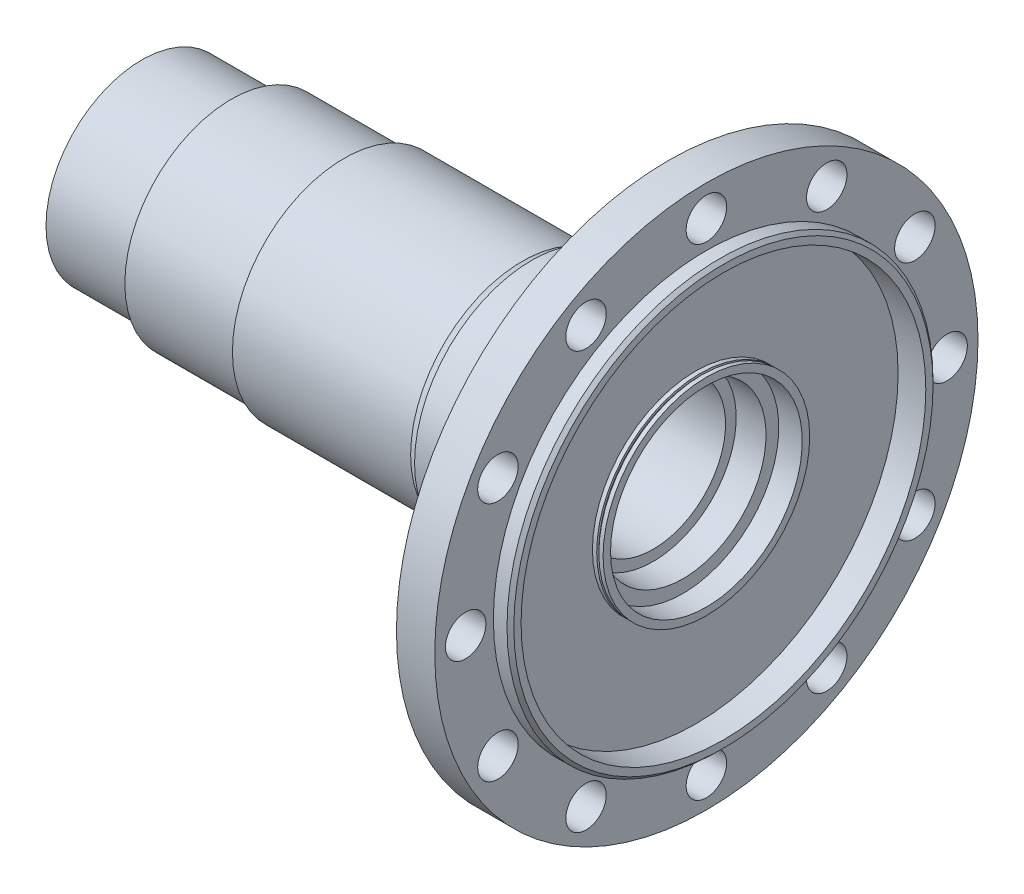
ISO-10303-21;
HEADER;
FILE_DESCRIPTION(('STEP AP214'),'2;1');
FILE_NAME('part.step','',(''),(''),'','','');
FILE_SCHEMA(('AUTOMOTIVE_DESIGN { 1 0 10303 214 1 1 1 1 }'));
ENDSEC;
DATA;
#1=APPLICATION_CONTEXT('core data for automotive mechanical design processes');
#2=APPLICATION_PROTOCOL_DEFINITION('international standard','automotive_design',2000,#1);
#3=PRODUCT_CONTEXT('',#1,'mechanical');
#4=PRODUCT('Part','Part','',(#3));
#5=PRODUCT_RELATED_PRODUCT_CATEGORY('part','',(#4));
#6=PRODUCT_DEFINITION_FORMATION('','',#4);
#7=PRODUCT_DEFINITION_CONTEXT('part definition',#1,'design');
#8=PRODUCT_DEFINITION('design','',#6,#7);
#9=PRODUCT_DEFINITION_SHAPE('','',#8);
#10=(LENGTH_UNIT() NAMED_UNIT(*) SI_UNIT(.MILLI.,.METRE.));
#11=(NAMED_UNIT(*) PLANE_ANGLE_UNIT() SI_UNIT($,.RADIAN.));
#12=(NAMED_UNIT(*) SI_UNIT($,.STERADIAN.) SOLID_ANGLE_UNIT());
#13=UNCERTAINTY_MEASURE_WITH_UNIT(LENGTH_MEASURE(1.E-05),#10,'distance_accuracy_value','');
#14=(GEOMETRIC_REPRESENTATION_CONTEXT(3) GLOBAL_UNCERTAINTY_ASSIGNED_CONTEXT((#13)) GLOBAL_UNIT_ASSIGNED_CONTEXT((#10,
#11,#12)) REPRESENTATION_CONTEXT('',''));
#15=CARTESIAN_POINT('',(0.,0.,0.));
#16=DIRECTION('',(0.,0.,1.));
#17=DIRECTION('',(1.,0.,0.));
#18=AXIS2_PLACEMENT_3D('',#15,#16,#17);
#19=CARTESIAN_POINT('',(265.,45.,0.));
#20=DIRECTION('',(1.,0.,0.));
#21=DIRECTION('',(0.,0.,-1.));
#22=AXIS2_PLACEMENT_3D('',#19,#20,#21);
#23=PLANE('',#22);
#24=CARTESIAN_POINT('',(265.,0.,0.));
#25=DIRECTION('',(-1.,0.,0.));
#26=DIRECTION('',(0.,0.,1.));
#27=AXIS2_PLACEMENT_3D('',#24,#25,#26);
#28=CIRCLE('',#27,45.);
#29=CARTESIAN_POINT('',(265.,0.,45.));
#30=VERTEX_POINT('',#29);
#31=EDGE_CURVE('E198',#30,#30,#28,.T.);
#32=ORIENTED_EDGE('',*,*,#31,.T.);
#33=EDGE_LOOP('',(#32));
#34=FACE_BOUND('',#33,.T.);
#35=CARTESIAN_POINT('',(265.,0.,0.));
#36=DIRECTION('',(-1.,0.,0.));
#37=DIRECTION('',(0.,0.,1.));
#38=AXIS2_PLACEMENT_3D('',#35,#36,#37);
#39=CIRCLE('',#38,48.5);
#40=CARTESIAN_POINT('',(265.,0.,48.5));
#41=VERTEX_POINT('',#40);
#42=EDGE_CURVE('E239',#41,#41,#39,.T.);
#43=ORIENTED_EDGE('',*,*,#42,.F.);
#44=EDGE_LOOP('',(#43));
#45=FACE_BOUND('',#44,.T.);
#46=ADVANCED_FACE('F50',(#34,#45),#23,.T.);
#47=CARTESIAN_POINT('',(0.,0.,0.));
#48=DIRECTION('',(1.,0.,0.));
#49=DIRECTION('',(0.,0.,-1.));
#50=AXIS2_PLACEMENT_3D('',#47,#48,#49);
#51=PLANE('',#50);
#52=CARTESIAN_POINT('',(0.,0.,0.));
#53=DIRECTION('',(-1.,0.,0.));
#54=DIRECTION('',(0.,0.,1.));
#55=AXIS2_PLACEMENT_3D('',#52,#53,#54);
#56=CIRCLE('',#55,31.);
#57=CARTESIAN_POINT('',(0.,0.,31.));
#58=VERTEX_POINT('',#57);
#59=EDGE_CURVE('E159',#58,#58,#56,.T.);
#60=ORIENTED_EDGE('',*,*,#59,.F.);
#61=EDGE_LOOP('',(#60));
#62=FACE_BOUND('',#61,.T.);
#63=CARTESIAN_POINT('',(0.,0.,0.));
#64=DIRECTION('',(-1.,0.,0.));
#65=DIRECTION('',(0.,0.,1.));
#66=AXIS2_PLACEMENT_3D('',#63,#64,#65);
#67=CIRCLE('',#66,45.);
#68=CARTESIAN_POINT('',(0.,0.,45.));
#69=VERTEX_POINT('',#68);
#70=EDGE_CURVE('E11',#69,#69,#67,.T.);
#71=ORIENTED_EDGE('',*,*,#70,.T.);
#72=EDGE_LOOP('',(#71));
#73=FACE_BOUND('',#72,.T.);
#74=ADVANCED_FACE('F53',(#62,#73),#51,.F.);
#75=CARTESIAN_POINT('',(0.,0.,0.));
#76=DIRECTION('',(-1.,0.,0.));
#77=DIRECTION('',(0.,0.,1.));
#78=AXIS2_PLACEMENT_3D('',#75,#76,#77);
#79=CYLINDRICAL_SURFACE('',#78,45.);
#80=ORIENTED_EDGE('',*,*,#70,.F.);
#81=EDGE_LOOP('',(#80));
#82=FACE_BOUND('',#81,.T.);
#83=CARTESIAN_POINT('',(42.,0.,0.));
#84=DIRECTION('',(-1.,0.,0.));
#85=DIRECTION('',(0.,0.,1.));
#86=AXIS2_PLACEMENT_3D('',#83,#84,#85);
#87=CIRCLE('',#86,45.);
#88=CARTESIAN_POINT('',(42.,0.,45.));
#89=VERTEX_POINT('',#88);
#90=EDGE_CURVE('E60',#89,#89,#87,.T.);
#91=ORIENTED_EDGE('',*,*,#90,.T.);
#92=EDGE_LOOP('',(#91));
#93=FACE_BOUND('',#92,.T.);
#94=ADVANCED_FACE('F382',(#82,#93),#79,.T.);
#95=CARTESIAN_POINT('',(42.,45.,0.));
#96=DIRECTION('',(1.,0.,0.));
#97=DIRECTION('',(0.,0.,-1.));
#98=AXIS2_PLACEMENT_3D('',#95,#96,#97);
#99=PLANE('',#98);
#100=ORIENTED_EDGE('',*,*,#90,.F.);
#101=EDGE_LOOP('',(#100));
#102=FACE_BOUND('',#101,.T.);
#103=CARTESIAN_POINT('',(42.,0.,0.));
#104=DIRECTION('',(-1.,0.,0.));
#105=DIRECTION('',(0.,0.,1.));
#106=AXIS2_PLACEMENT_3D('',#103,#104,#105);
#107=CIRCLE('',#106,50.);
#108=CARTESIAN_POINT('',(42.,0.,50.));
#109=VERTEX_POINT('',#108);
#110=EDGE_CURVE('E66',#109,#109,#107,.T.);
#111=ORIENTED_EDGE('',*,*,#110,.T.);
#112=EDGE_LOOP('',(#111));
#113=FACE_BOUND('',#112,.T.);
#114=ADVANCED_FACE('F458',(#102,#113),#99,.F.);
#115=CARTESIAN_POINT('',(0.,0.,0.));
#116=DIRECTION('',(-1.,0.,0.));
#117=DIRECTION('',(0.,0.,1.));
#118=AXIS2_PLACEMENT_3D('',#115,#116,#117);
#119=CYLINDRICAL_SURFACE('',#118,50.);
#120=ORIENTED_EDGE('',*,*,#110,.F.);
#121=EDGE_LOOP('',(#120));
#122=FACE_BOUND('',#121,.T.);
#123=CARTESIAN_POINT('',(95.,0.,0.));
#124=DIRECTION('',(-1.,0.,0.));
#125=DIRECTION('',(0.,0.,1.));
#126=AXIS2_PLACEMENT_3D('',#123,#124,#125);
#127=CIRCLE('',#126,50.);
#128=CARTESIAN_POINT('',(95.,0.,50.));
#129=VERTEX_POINT('',#128);
#130=EDGE_CURVE('E83',#129,#129,#127,.T.);
#131=ORIENTED_EDGE('',*,*,#130,.T.);
#132=EDGE_LOOP('',(#131));
#133=FACE_BOUND('',#132,.T.);
#134=ADVANCED_FACE('F455',(#122,#133),#119,.T.);
#135=CARTESIAN_POINT('',(95.,50.,0.));
#136=DIRECTION('',(1.,0.,0.));
#137=DIRECTION('',(0.,0.,-1.));
#138=AXIS2_PLACEMENT_3D('',#135,#136,#137);
#139=PLANE('',#138);
#140=ORIENTED_EDGE('',*,*,#130,.F.);
#141=EDGE_LOOP('',(#140));
#142=FACE_BOUND('',#141,.T.);
#143=CARTESIAN_POINT('',(95.,0.,0.));
#144=DIRECTION('',(-1.,0.,0.));
#145=DIRECTION('',(0.,0.,1.));
#146=AXIS2_PLACEMENT_3D('',#143,#144,#145);
#147=CIRCLE('',#146,52.5);
#148=CARTESIAN_POINT('',(95.,0.,52.5));
#149=VERTEX_POINT('',#148);
#150=EDGE_CURVE('E88',#149,#149,#147,.T.);
#151=ORIENTED_EDGE('',*,*,#150,.T.);
#152=EDGE_LOOP('',(#151));
#153=FACE_BOUND('',#152,.T.);
#154=ADVANCED_FACE('F452',(#142,#153),#139,.F.);
#155=CARTESIAN_POINT('',(0.,0.,0.));
#156=DIRECTION('',(-1.,0.,0.));
#157=DIRECTION('',(0.,0.,1.));
#158=AXIS2_PLACEMENT_3D('',#155,#156,#157);
#159=CYLINDRICAL_SURFACE('',#158,52.5);
#160=ORIENTED_EDGE('',*,*,#150,.F.);
#161=EDGE_LOOP('',(#160));
#162=FACE_BOUND('',#161,.T.);
#163=CARTESIAN_POINT('',(178.669872981078,0.,0.));
#164=DIRECTION('',(-1.,0.,0.));
#165=DIRECTION('',(0.,0.,1.));
#166=AXIS2_PLACEMENT_3D('',#163,#164,#165);
#167=CIRCLE('',#166,52.5);
#168=CARTESIAN_POINT('',(178.669872981078,0.,52.5));
#169=VERTEX_POINT('',#168);
#170=EDGE_CURVE('E93',#169,#169,#167,.T.);
#171=ORIENTED_EDGE('',*,*,#170,.T.);
#172=EDGE_LOOP('',(#171));
#173=FACE_BOUND('',#172,.T.);
#174=ADVANCED_FACE('F449',(#162,#173),#159,.T.);
#175=CARTESIAN_POINT('',(183.,0.,0.));
#176=DIRECTION('',(1.,0.,0.));
#177=DIRECTION('',(0.,0.,-1.));
#178=AXIS2_PLACEMENT_3D('',#175,#176,#177);
#179=CONICAL_SURFACE('',#178,55.,0.5235987755983);
#180=ORIENTED_EDGE('',*,*,#170,.F.);
#181=EDGE_LOOP('',(#180));
#182=FACE_BOUND('',#181,.T.);
#183=CARTESIAN_POINT('',(183.,0.,0.));
#184=DIRECTION('',(-1.,0.,0.));
#185=DIRECTION('',(0.,0.,1.));
#186=AXIS2_PLACEMENT_3D('',#183,#184,#185);
#187=CIRCLE('',#186,55.);
#188=CARTESIAN_POINT('',(183.,0.,55.));
#189=VERTEX_POINT('',#188);
#190=EDGE_CURVE('E101',#189,#189,#187,.T.);
#191=ORIENTED_EDGE('',*,*,#190,.T.);
#192=EDGE_LOOP('',(#191));
#193=FACE_BOUND('',#192,.T.);
#194=ADVANCED_FACE('F446',(#182,#193),#179,.T.);
#195=CARTESIAN_POINT('',(0.,0.,0.));
#196=DIRECTION('',(-1.,0.,0.));
#197=DIRECTION('',(0.,0.,1.));
#198=AXIS2_PLACEMENT_3D('',#195,#196,#197);
#199=CYLINDRICAL_SURFACE('',#198,55.);
#200=ORIENTED_EDGE('',*,*,#190,.F.);
#201=EDGE_LOOP('',(#200));
#202=FACE_BOUND('',#201,.T.);
#203=CARTESIAN_POINT('',(215.,0.,0.));
#204=DIRECTION('',(-1.,0.,0.));
#205=DIRECTION('',(0.,0.,1.));
#206=AXIS2_PLACEMENT_3D('',#203,#204,#205);
#207=CIRCLE('',#206,55.);
#208=CARTESIAN_POINT('',(215.,0.,55.));
#209=VERTEX_POINT('',#208);
#210=EDGE_CURVE('E105',#209,#209,#207,.T.);
#211=ORIENTED_EDGE('',*,*,#210,.T.);
#212=EDGE_LOOP('',(#211));
#213=FACE_BOUND('',#212,.T.);
#214=ADVANCED_FACE('F443',(#202,#213),#199,.T.);
#215=CARTESIAN_POINT('',(215.,55.,0.));
#216=DIRECTION('',(1.,0.,0.));
#217=DIRECTION('',(0.,0.,-1.));
#218=AXIS2_PLACEMENT_3D('',#215,#216,#217);
#219=PLANE('',#218);
#220=ORIENTED_EDGE('',*,*,#210,.F.);
#221=EDGE_LOOP('',(#220));
#222=FACE_BOUND('',#221,.T.);
#223=CARTESIAN_POINT('',(215.,0.,0.));
#224=DIRECTION('',(-1.,0.,0.));
#225=DIRECTION('',(0.,0.,1.));
#226=AXIS2_PLACEMENT_3D('',#223,#224,#225);
#227=CIRCLE('',#226,62.5);
#228=CARTESIAN_POINT('',(215.,0.,62.5));
#229=VERTEX_POINT('',#228);
#230=EDGE_CURVE('E110',#229,#229,#227,.T.);
#231=ORIENTED_EDGE('',*,*,#230,.T.);
#232=EDGE_LOOP('',(#231));
#233=FACE_BOUND('',#232,.T.);
#234=ADVANCED_FACE('F440',(#222,#233),#219,.F.);
#235=CARTESIAN_POINT('',(0.,0.,0.));
#236=DIRECTION('',(-1.,0.,0.));
#237=DIRECTION('',(0.,0.,1.));
#238=AXIS2_PLACEMENT_3D('',#235,#236,#237);
#239=CYLINDRICAL_SURFACE('',#238,62.5);
#240=ORIENTED_EDGE('',*,*,#230,.F.);
#241=EDGE_LOOP('',(#240));
#242=FACE_BOUND('',#241,.T.);
#243=CARTESIAN_POINT('',(239.,0.,0.));
#244=DIRECTION('',(-1.,0.,0.));
#245=DIRECTION('',(0.,0.,1.));
#246=AXIS2_PLACEMENT_3D('',#243,#244,#245);
#247=CIRCLE('',#246,62.5);
#248=CARTESIAN_POINT('',(239.,0.,62.5));
#249=VERTEX_POINT('',#248);
#250=EDGE_CURVE('E115',#249,#249,#247,.T.);
#251=ORIENTED_EDGE('',*,*,#250,.T.);
#252=EDGE_LOOP('',(#251));
#253=FACE_BOUND('',#252,.T.);
#254=ADVANCED_FACE('F437',(#242,#253),#239,.T.);
#255=CARTESIAN_POINT('',(239.,62.5,0.));
#256=DIRECTION('',(1.,0.,0.));
#257=DIRECTION('',(0.,0.,-1.));
#258=AXIS2_PLACEMENT_3D('',#255,#256,#257);
#259=PLANE('',#258);
#260=ORIENTED_EDGE('',*,*,#250,.F.);
#261=EDGE_LOOP('',(#260));
#262=FACE_BOUND('',#261,.T.);
#263=CARTESIAN_POINT('',(239.,0.,0.));
#264=DIRECTION('',(-1.,0.,0.));
#265=DIRECTION('',(0.,0.,1.));
#266=AXIS2_PLACEMENT_3D('',#263,#264,#265);
#267=CIRCLE('',#266,100.);
#268=CARTESIAN_POINT('',(239.,0.,100.));
#269=VERTEX_POINT('',#268);
#270=EDGE_CURVE('E123',#269,#269,#267,.T.);
#271=ORIENTED_EDGE('',*,*,#270,.T.);
#272=EDGE_LOOP('',(#271));
#273=FACE_BOUND('',#272,.T.);
#274=ADVANCED_FACE('F434',(#262,#273),#259,.F.);
#275=CARTESIAN_POINT('',(0.,0.,0.));
#276=DIRECTION('',(-1.,0.,0.));
#277=DIRECTION('',(0.,0.,1.));
#278=AXIS2_PLACEMENT_3D('',#275,#276,#277);
#279=CYLINDRICAL_SURFACE('',#278,100.);
#280=ORIENTED_EDGE('',*,*,#270,.F.);
#281=EDGE_LOOP('',(#280));
#282=FACE_BOUND('',#281,.T.);
#283=CARTESIAN_POINT('',(247.,0.,0.));
#284=DIRECTION('',(-1.,0.,0.));
#285=DIRECTION('',(0.,0.,1.));
#286=AXIS2_PLACEMENT_3D('',#283,#284,#285);
#287=CIRCLE('',#286,100.);
#288=CARTESIAN_POINT('',(247.,0.,100.));
#289=VERTEX_POINT('',#288);
#290=EDGE_CURVE('E127',#289,#289,#287,.T.);
#291=ORIENTED_EDGE('',*,*,#290,.T.);
#292=EDGE_LOOP('',(#291));
#293=FACE_BOUND('',#292,.T.);
#294=ADVANCED_FACE('F431',(#282,#293),#279,.T.);
#295=CARTESIAN_POINT('',(247.,100.,0.));
#296=DIRECTION('',(1.,0.,0.));
#297=DIRECTION('',(0.,0.,-1.));
#298=AXIS2_PLACEMENT_3D('',#295,#296,#297);
#299=PLANE('',#298);
#300=CARTESIAN_POINT('',(247.,97.8608706276416,-56.5));
#301=DIRECTION('',(1.,0.,0.));
#302=DIRECTION('',(0.,0.,-1.));
#303=AXIS2_PLACEMENT_3D('',#300,#301,#302);
#304=CIRCLE('',#303,9.5);
#305=CARTESIAN_POINT('',(247.,97.8608706276416,-66.));
#306=VERTEX_POINT('',#305);
#307=EDGE_CURVE('E298',#306,#306,#304,.F.);
#308=ORIENTED_EDGE('',*,*,#307,.F.);
#309=EDGE_LOOP('',(#308));
#310=FACE_BOUND('',#309,.T.);
#311=CARTESIAN_POINT('',(247.,56.4999999999999,-97.8608706276416));
#312=DIRECTION('',(1.,0.,0.));
#313=DIRECTION('',(0.,0.,-1.));
#314=AXIS2_PLACEMENT_3D('',#311,#312,#313);
#315=CIRCLE('',#314,9.49999999999999);
#316=CARTESIAN_POINT('',(247.,56.4999999999999,-107.360870627642));
#317=VERTEX_POINT('',#316);
#318=EDGE_CURVE('E293',#317,#317,#315,.F.);
#319=ORIENTED_EDGE('',*,*,#318,.F.);
#320=EDGE_LOOP('',(#319));
#321=FACE_BOUND('',#320,.T.);
#322=CARTESIAN_POINT('',(247.,0.,-113.));
#323=DIRECTION('',(1.,0.,0.));
#324=DIRECTION('',(0.,0.,-1.));
#325=AXIS2_PLACEMENT_3D('',#322,#323,#324);
#326=CIRCLE('',#325,9.49999999999999);
#327=CARTESIAN_POINT('',(247.,0.,-122.5));
#328=VERTEX_POINT('',#327);
#329=EDGE_CURVE('E288',#328,#328,#326,.F.);
#330=ORIENTED_EDGE('',*,*,#329,.F.);
#331=EDGE_LOOP('',(#330));
#332=FACE_BOUND('',#331,.T.);
#333=CARTESIAN_POINT('',(247.,-56.5,-97.8608706276415));
#334=DIRECTION('',(1.,0.,0.));
#335=DIRECTION('',(0.,0.,-1.));
#336=AXIS2_PLACEMENT_3D('',#333,#334,#335);
#337=CIRCLE('',#336,9.49999999999999);
#338=CARTESIAN_POINT('',(247.,-56.5,-107.360870627642));
#339=VERTEX_POINT('',#338);
#340=EDGE_CURVE('E283',#339,#339,#337,.F.);
#341=ORIENTED_EDGE('',*,*,#340,.F.);
#342=EDGE_LOOP('',(#341));
#343=FACE_BOUND('',#342,.T.);
#344=CARTESIAN_POINT('',(247.,-97.8608706276416,-56.5));
#345=DIRECTION('',(1.,0.,0.));
#346=DIRECTION('',(0.,0.,-1.));
#347=AXIS2_PLACEMENT_3D('',#344,#345,#346);
#348=CIRCLE('',#347,9.5);
#349=CARTESIAN_POINT('',(247.,-97.8608706276416,-66.));
#350=VERTEX_POINT('',#349);
#351=EDGE_CURVE('E278',#350,#350,#348,.F.);
#352=ORIENTED_EDGE('',*,*,#351,.F.);
#353=EDGE_LOOP('',(#352));
#354=FACE_BOUND('',#353,.T.);
#355=CARTESIAN_POINT('',(247.,-113.,0.));
#356=DIRECTION('',(1.,0.,0.));
#357=DIRECTION('',(0.,0.,-1.));
#358=AXIS2_PLACEMENT_3D('',#355,#356,#357);
#359=CIRCLE('',#358,9.5);
#360=CARTESIAN_POINT('',(247.,-113.,-9.49999999999998));
#361=VERTEX_POINT('',#360);
#362=EDGE_CURVE('E273',#361,#361,#359,.F.);
#363=ORIENTED_EDGE('',*,*,#362,.F.);
#364=EDGE_LOOP('',(#363));
#365=FACE_BOUND('',#364,.T.);
#366=CARTESIAN_POINT('',(247.,-97.8608706276415,56.5));
#367=DIRECTION('',(1.,0.,0.));
#368=DIRECTION('',(0.,0.,-1.));
#369=AXIS2_PLACEMENT_3D('',#366,#367,#368);
#370=CIRCLE('',#369,9.5);
#371=CARTESIAN_POINT('',(247.,-97.8608706276415,47.));
#372=VERTEX_POINT('',#371);
#373=EDGE_CURVE('E268',#372,#372,#370,.F.);
#374=ORIENTED_EDGE('',*,*,#373,.F.);
#375=EDGE_LOOP('',(#374));
#376=FACE_BOUND('',#375,.T.);
#377=CARTESIAN_POINT('',(247.,-56.5,97.8608706276416));
#378=DIRECTION('',(1.,0.,0.));
#379=DIRECTION('',(0.,0.,-1.));
#380=AXIS2_PLACEMENT_3D('',#377,#378,#379);
#381=CIRCLE('',#380,9.49999999999999);
#382=CARTESIAN_POINT('',(247.,-56.5,88.3608706276416));
#383=VERTEX_POINT('',#382);
#384=EDGE_CURVE('E263',#383,#383,#381,.F.);
#385=ORIENTED_EDGE('',*,*,#384,.F.);
#386=EDGE_LOOP('',(#385));
#387=FACE_BOUND('',#386,.T.);
#388=CARTESIAN_POINT('',(247.,0.,113.));
#389=DIRECTION('',(1.,0.,0.));
#390=DIRECTION('',(0.,0.,-1.));
#391=AXIS2_PLACEMENT_3D('',#388,#389,#390);
#392=CIRCLE('',#391,9.49999999999999);
#393=CARTESIAN_POINT('',(247.,0.,103.5));
#394=VERTEX_POINT('',#393);
#395=EDGE_CURVE('E258',#394,#394,#392,.F.);
#396=ORIENTED_EDGE('',*,*,#395,.F.);
#397=EDGE_LOOP('',(#396));
#398=FACE_BOUND('',#397,.T.);
#399=CARTESIAN_POINT('',(247.,56.5,97.8608706276416));
#400=DIRECTION('',(1.,0.,0.));
#401=DIRECTION('',(0.,0.,-1.));
#402=AXIS2_PLACEMENT_3D('',#399,#400,#401);
#403=CIRCLE('',#402,9.49999999999999);
#404=CARTESIAN_POINT('',(247.,56.5,88.3608706276416));
#405=VERTEX_POINT('',#404);
#406=EDGE_CURVE('E253',#405,#405,#403,.F.);
#407=ORIENTED_EDGE('',*,*,#406,.F.);
#408=EDGE_LOOP('',(#407));
#409=FACE_BOUND('',#408,.T.);
#410=CARTESIAN_POINT('',(247.,97.8608706276416,56.5));
#411=DIRECTION('',(1.,0.,0.));
#412=DIRECTION('',(0.,0.,-1.));
#413=AXIS2_PLACEMENT_3D('',#410,#411,#412);
#414=CIRCLE('',#413,9.5);
#415=CARTESIAN_POINT('',(247.,97.8608706276416,47.));
#416=VERTEX_POINT('',#415);
#417=EDGE_CURVE('E248',#416,#416,#414,.F.);
#418=ORIENTED_EDGE('',*,*,#417,.F.);
#419=EDGE_LOOP('',(#418));
#420=FACE_BOUND('',#419,.T.);
#421=CARTESIAN_POINT('',(247.,113.,0.));
#422=DIRECTION('',(1.,0.,0.));
#423=DIRECTION('',(0.,0.,-1.));
#424=AXIS2_PLACEMENT_3D('',#421,#422,#423);
#425=CIRCLE('',#424,9.5);
#426=CARTESIAN_POINT('',(247.,113.,-9.50000000000001));
#427=VERTEX_POINT('',#426);
#428=EDGE_CURVE('E244',#427,#427,#425,.F.);
#429=ORIENTED_EDGE('',*,*,#428,.F.);
#430=EDGE_LOOP('',(#429));
#431=FACE_BOUND('',#430,.T.);
#432=ORIENTED_EDGE('',*,*,#290,.F.);
#433=EDGE_LOOP('',(#432));
#434=FACE_BOUND('',#433,.T.);
#435=CARTESIAN_POINT('',(247.,0.,0.));
#436=DIRECTION('',(-1.,0.,0.));
#437=DIRECTION('',(0.,0.,1.));
#438=AXIS2_PLACEMENT_3D('',#435,#436,#437);
#439=CIRCLE('',#438,127.5);
#440=CARTESIAN_POINT('',(247.,0.,127.5));
#441=VERTEX_POINT('',#440);
#442=EDGE_CURVE('E132',#441,#441,#439,.T.);
#443=ORIENTED_EDGE('',*,*,#442,.T.);
#444=EDGE_LOOP('',(#443));
#445=FACE_BOUND('',#444,.T.);
#446=ADVANCED_FACE('F428',(#310,#321,#332,#343,#354,#365,#376,#387,#398,#409,#420,#431,#434,
#445),#299,.F.);
#447=CARTESIAN_POINT('',(0.,0.,0.));
#448=DIRECTION('',(-1.,0.,0.));
#449=DIRECTION('',(0.,0.,1.));
#450=AXIS2_PLACEMENT_3D('',#447,#448,#449);
#451=CYLINDRICAL_SURFACE('',#450,127.5);
#452=ORIENTED_EDGE('',*,*,#442,.F.);
#453=EDGE_LOOP('',(#452));
#454=FACE_BOUND('',#453,.T.);
#455=CARTESIAN_POINT('',(265.,0.,0.));
#456=DIRECTION('',(-1.,0.,0.));
#457=DIRECTION('',(0.,0.,1.));
#458=AXIS2_PLACEMENT_3D('',#455,#456,#457);
#459=CIRCLE('',#458,127.5);
#460=CARTESIAN_POINT('',(265.,0.,127.5));
#461=VERTEX_POINT('',#460);
#462=EDGE_CURVE('E137',#461,#461,#459,.T.);
#463=ORIENTED_EDGE('',*,*,#462,.T.);
#464=EDGE_LOOP('',(#463));
#465=FACE_BOUND('',#464,.T.);
#466=ADVANCED_FACE('F315',(#454,#465),#451,.T.);
#467=CARTESIAN_POINT('',(265.,127.5,0.));
#468=DIRECTION('',(-1.,0.,0.));
#469=DIRECTION('',(0.,0.,1.));
#470=AXIS2_PLACEMENT_3D('',#467,#468,#469);
#471=PLANE('',#470);
#472=CARTESIAN_POINT('',(265.,97.8608706276416,-56.5));
#473=DIRECTION('',(-1.,0.,0.));
#474=DIRECTION('',(0.,0.,1.));
#475=AXIS2_PLACEMENT_3D('',#472,#473,#474);
#476=CIRCLE('',#475,9.5);
#477=CARTESIAN_POINT('',(265.,97.8608706276416,-47.));
#478=VERTEX_POINT('',#477);
#479=EDGE_CURVE('E55',#478,#478,#476,.F.);
#480=ORIENTED_EDGE('',*,*,#479,.F.);
#481=EDGE_LOOP('',(#480));
#482=FACE_BOUND('',#481,.T.);
#483=CARTESIAN_POINT('',(265.,56.4999999999999,-97.8608706276416));
#484=DIRECTION('',(-1.,0.,0.));
#485=DIRECTION('',(0.,0.,1.));
#486=AXIS2_PLACEMENT_3D('',#483,#484,#485);
#487=CIRCLE('',#486,9.49999999999999);
#488=CARTESIAN_POINT('',(265.,56.4999999999999,-88.3608706276416));
#489=VERTEX_POINT('',#488);
#490=EDGE_CURVE('E297',#489,#489,#487,.F.);
#491=ORIENTED_EDGE('',*,*,#490,.F.);
#492=EDGE_LOOP('',(#491));
#493=FACE_BOUND('',#492,.T.);
#494=CARTESIAN_POINT('',(265.,0.,-113.));
#495=DIRECTION('',(-1.,0.,0.));
#496=DIRECTION('',(0.,0.,1.));
#497=AXIS2_PLACEMENT_3D('',#494,#495,#496);
#498=CIRCLE('',#497,9.49999999999999);
#499=CARTESIAN_POINT('',(265.,0.,-103.5));
#500=VERTEX_POINT('',#499);
#501=EDGE_CURVE('E292',#500,#500,#498,.F.);
#502=ORIENTED_EDGE('',*,*,#501,.F.);
#503=EDGE_LOOP('',(#502));
#504=FACE_BOUND('',#503,.T.);
#505=CARTESIAN_POINT('',(265.,-56.5,-97.8608706276415));
#506=DIRECTION('',(-1.,0.,0.));
#507=DIRECTION('',(0.,0.,1.));
#508=AXIS2_PLACEMENT_3D('',#505,#506,#507);
#509=CIRCLE('',#508,9.49999999999999);
#510=CARTESIAN_POINT('',(265.,-56.5,-88.3608706276415));
#511=VERTEX_POINT('',#510);
#512=EDGE_CURVE('E287',#511,#511,#509,.F.);
#513=ORIENTED_EDGE('',*,*,#512,.F.);
#514=EDGE_LOOP('',(#513));
#515=FACE_BOUND('',#514,.T.);
#516=CARTESIAN_POINT('',(265.,-97.8608706276416,-56.5));
#517=DIRECTION('',(-1.,0.,0.));
#518=DIRECTION('',(0.,0.,1.));
#519=AXIS2_PLACEMENT_3D('',#516,#517,#518);
#520=CIRCLE('',#519,9.5);
#521=CARTESIAN_POINT('',(265.,-97.8608706276416,-47.));
#522=VERTEX_POINT('',#521);
#523=EDGE_CURVE('E282',#522,#522,#520,.F.);
#524=ORIENTED_EDGE('',*,*,#523,.F.);
#525=EDGE_LOOP('',(#524));
#526=FACE_BOUND('',#525,.T.);
#527=CARTESIAN_POINT('',(265.,-113.,0.));
#528=DIRECTION('',(-1.,0.,0.));
#529=DIRECTION('',(0.,0.,1.));
#530=AXIS2_PLACEMENT_3D('',#527,#528,#529);
#531=CIRCLE('',#530,9.5);
#532=CARTESIAN_POINT('',(265.,-113.,9.50000000000002));
#533=VERTEX_POINT('',#532);
#534=EDGE_CURVE('E277',#533,#533,#531,.F.);
#535=ORIENTED_EDGE('',*,*,#534,.F.);
#536=EDGE_LOOP('',(#535));
#537=FACE_BOUND('',#536,.T.);
#538=CARTESIAN_POINT('',(265.,-97.8608706276415,56.5));
#539=DIRECTION('',(-1.,0.,0.));
#540=DIRECTION('',(0.,0.,1.));
#541=AXIS2_PLACEMENT_3D('',#538,#539,#540);
#542=CIRCLE('',#541,9.5);
#543=CARTESIAN_POINT('',(265.,-97.8608706276415,66.0000000000001));
#544=VERTEX_POINT('',#543);
#545=EDGE_CURVE('E272',#544,#544,#542,.F.);
#546=ORIENTED_EDGE('',*,*,#545,.F.);
#547=EDGE_LOOP('',(#546));
#548=FACE_BOUND('',#547,.T.);
#549=CARTESIAN_POINT('',(265.,-56.5,97.8608706276416));
#550=DIRECTION('',(-1.,0.,0.));
#551=DIRECTION('',(0.,0.,1.));
#552=AXIS2_PLACEMENT_3D('',#549,#550,#551);
#553=CIRCLE('',#552,9.49999999999999);
#554=CARTESIAN_POINT('',(265.,-56.5,107.360870627642));
#555=VERTEX_POINT('',#554);
#556=EDGE_CURVE('E267',#555,#555,#553,.F.);
#557=ORIENTED_EDGE('',*,*,#556,.F.);
#558=EDGE_LOOP('',(#557));
#559=FACE_BOUND('',#558,.T.);
#560=CARTESIAN_POINT('',(265.,0.,113.));
#561=DIRECTION('',(-1.,0.,0.));
#562=DIRECTION('',(0.,0.,1.));
#563=AXIS2_PLACEMENT_3D('',#560,#561,#562);
#564=CIRCLE('',#563,9.49999999999999);
#565=CARTESIAN_POINT('',(265.,0.,122.5));
#566=VERTEX_POINT('',#565);
#567=EDGE_CURVE('E262',#566,#566,#564,.F.);
#568=ORIENTED_EDGE('',*,*,#567,.F.);
#569=EDGE_LOOP('',(#568));
#570=FACE_BOUND('',#569,.T.);
#571=CARTESIAN_POINT('',(265.,56.5,97.8608706276416));
#572=DIRECTION('',(-1.,0.,0.));
#573=DIRECTION('',(0.,0.,1.));
#574=AXIS2_PLACEMENT_3D('',#571,#572,#573);
#575=CIRCLE('',#574,9.49999999999999);
#576=CARTESIAN_POINT('',(265.,56.5,107.360870627642));
#577=VERTEX_POINT('',#576);
#578=EDGE_CURVE('E257',#577,#577,#575,.F.);
#579=ORIENTED_EDGE('',*,*,#578,.F.);
#580=EDGE_LOOP('',(#579));
#581=FACE_BOUND('',#580,.T.);
#582=CARTESIAN_POINT('',(265.,97.8608706276416,56.5));
#583=DIRECTION('',(-1.,0.,0.));
#584=DIRECTION('',(0.,0.,1.));
#585=AXIS2_PLACEMENT_3D('',#582,#583,#584);
#586=CIRCLE('',#585,9.5);
#587=CARTESIAN_POINT('',(265.,97.8608706276416,66.));
#588=VERTEX_POINT('',#587);
#589=EDGE_CURVE('E252',#588,#588,#586,.F.);
#590=ORIENTED_EDGE('',*,*,#589,.F.);
#591=EDGE_LOOP('',(#590));
#592=FACE_BOUND('',#591,.T.);
#593=CARTESIAN_POINT('',(265.,113.,0.));
#594=DIRECTION('',(-1.,0.,0.));
#595=DIRECTION('',(0.,0.,1.));
#596=AXIS2_PLACEMENT_3D('',#593,#594,#595);
#597=CIRCLE('',#596,9.5);
#598=CARTESIAN_POINT('',(265.,113.,9.49999999999999));
#599=VERTEX_POINT('',#598);
#600=EDGE_CURVE('E72',#599,#599,#597,.F.);
#601=ORIENTED_EDGE('',*,*,#600,.F.);
#602=EDGE_LOOP('',(#601));
#603=FACE_BOUND('',#602,.T.);
#604=ORIENTED_EDGE('',*,*,#462,.F.);
#605=EDGE_LOOP('',(#604));
#606=FACE_BOUND('',#605,.T.);
#607=CARTESIAN_POINT('',(265.,0.,0.));
#608=DIRECTION('',(-1.,0.,0.));
#609=DIRECTION('',(0.,0.,1.));
#610=AXIS2_PLACEMENT_3D('',#607,#608,#609);
#611=CIRCLE('',#610,100.);
#612=CARTESIAN_POINT('',(265.,0.,100.));
#613=VERTEX_POINT('',#612);
#614=EDGE_CURVE('E145',#613,#613,#611,.T.);
#615=ORIENTED_EDGE('',*,*,#614,.T.);
#616=EDGE_LOOP('',(#615));
#617=FACE_BOUND('',#616,.T.);
#618=ADVANCED_FACE('F311',(#482,#493,#504,#515,#526,#537,#548,#559,#570,#581,#592,#603,#606,
#617),#471,.F.);
#619=CARTESIAN_POINT('',(0.,0.,0.));
#620=DIRECTION('',(-1.,0.,0.));
#621=DIRECTION('',(0.,0.,1.));
#622=AXIS2_PLACEMENT_3D('',#619,#620,#621);
#623=CYLINDRICAL_SURFACE('',#622,100.);
#624=ORIENTED_EDGE('',*,*,#614,.F.);
#625=EDGE_LOOP('',(#624));
#626=FACE_BOUND('',#625,.T.);
#627=CARTESIAN_POINT('',(271.4,0.,0.));
#628=DIRECTION('',(-1.,0.,0.));
#629=DIRECTION('',(0.,0.,1.));
#630=AXIS2_PLACEMENT_3D('',#627,#628,#629);
#631=CIRCLE('',#630,100.);
#632=CARTESIAN_POINT('',(271.4,0.,100.));
#633=VERTEX_POINT('',#632);
#634=EDGE_CURVE('E149',#633,#633,#631,.T.);
#635=ORIENTED_EDGE('',*,*,#634,.T.);
#636=EDGE_LOOP('',(#635));
#637=FACE_BOUND('',#636,.T.);
#638=ADVANCED_FACE('F314',(#626,#637),#623,.T.);
#639=CARTESIAN_POINT('',(273.,0.,0.));
#640=DIRECTION('',(-1.,0.,0.));
#641=DIRECTION('',(0.,0.,1.));
#642=AXIS2_PLACEMENT_3D('',#639,#640,#641);
#643=CONICAL_SURFACE('',#642,98.4,0.785398163397435);
#644=ORIENTED_EDGE('',*,*,#634,.F.);
#645=EDGE_LOOP('',(#644));
#646=FACE_BOUND('',#645,.T.);
#647=CARTESIAN_POINT('',(273.,0.,0.));
#648=DIRECTION('',(-1.,0.,0.));
#649=DIRECTION('',(0.,0.,1.));
#650=AXIS2_PLACEMENT_3D('',#647,#648,#649);
#651=CIRCLE('',#650,98.4);
#652=CARTESIAN_POINT('',(273.,0.,98.4));
#653=VERTEX_POINT('',#652);
#654=EDGE_CURVE('E154',#653,#653,#651,.T.);
#655=ORIENTED_EDGE('',*,*,#654,.T.);
#656=EDGE_LOOP('',(#655));
#657=FACE_BOUND('',#656,.T.);
#658=ADVANCED_FACE('F356',(#646,#657),#643,.T.);
#659=CARTESIAN_POINT('',(273.,98.4,0.));
#660=DIRECTION('',(-1.,0.,0.));
#661=DIRECTION('',(0.,0.,1.));
#662=AXIS2_PLACEMENT_3D('',#659,#660,#661);
#663=PLANE('',#662);
#664=CARTESIAN_POINT('',(273.,0.,0.));
#665=DIRECTION('',(-1.,0.,0.));
#666=DIRECTION('',(0.,0.,1.));
#667=AXIS2_PLACEMENT_3D('',#664,#665,#666);
#668=CIRCLE('',#667,95.);
#669=CARTESIAN_POINT('',(273.,0.,95.));
#670=VERTEX_POINT('',#669);
#671=EDGE_CURVE('E203',#670,#670,#668,.T.);
#672=ORIENTED_EDGE('',*,*,#671,.T.);
#673=EDGE_LOOP('',(#672));
#674=FACE_BOUND('',#673,.T.);
#675=ORIENTED_EDGE('',*,*,#654,.F.);
#676=EDGE_LOOP('',(#675));
#677=FACE_BOUND('',#676,.T.);
#678=ADVANCED_FACE('F362',(#674,#677),#663,.F.);
#679=CARTESIAN_POINT('',(0.,0.,0.));
#680=DIRECTION('',(-1.,0.,0.));
#681=DIRECTION('',(0.,0.,1.));
#682=AXIS2_PLACEMENT_3D('',#679,#680,#681);
#683=CYLINDRICAL_SURFACE('',#682,31.);
#684=ORIENTED_EDGE('',*,*,#59,.T.);
#685=EDGE_LOOP('',(#684));
#686=FACE_BOUND('',#685,.T.);
#687=CARTESIAN_POINT('',(203.5,0.,0.));
#688=DIRECTION('',(-1.,0.,0.));
#689=DIRECTION('',(0.,0.,1.));
#690=AXIS2_PLACEMENT_3D('',#687,#688,#689);
#691=CIRCLE('',#690,31.);
#692=CARTESIAN_POINT('',(203.5,0.,31.));
#693=VERTEX_POINT('',#692);
#694=EDGE_CURVE('E167',#693,#693,#691,.T.);
#695=ORIENTED_EDGE('',*,*,#694,.F.);
#696=EDGE_LOOP('',(#695));
#697=FACE_BOUND('',#696,.T.);
#698=ADVANCED_FACE('F367',(#686,#697),#683,.F.);
#699=CARTESIAN_POINT('',(203.5,31.,0.));
#700=DIRECTION('',(1.,0.,0.));
#701=DIRECTION('',(0.,0.,-1.));
#702=AXIS2_PLACEMENT_3D('',#699,#700,#701);
#703=PLANE('',#702);
#704=ORIENTED_EDGE('',*,*,#694,.T.);
#705=EDGE_LOOP('',(#704));
#706=FACE_BOUND('',#705,.T.);
#707=CARTESIAN_POINT('',(203.5,0.,0.));
#708=DIRECTION('',(-1.,0.,0.));
#709=DIRECTION('',(0.,0.,1.));
#710=AXIS2_PLACEMENT_3D('',#707,#708,#709);
#711=CIRCLE('',#710,34.);
#712=CARTESIAN_POINT('',(203.5,0.,34.));
#713=VERTEX_POINT('',#712);
#714=EDGE_CURVE('E171',#713,#713,#711,.T.);
#715=ORIENTED_EDGE('',*,*,#714,.F.);
#716=EDGE_LOOP('',(#715));
#717=FACE_BOUND('',#716,.T.);
#718=ADVANCED_FACE('F372',(#706,#717),#703,.T.);
#719=CARTESIAN_POINT('',(0.,0.,0.));
#720=DIRECTION('',(-1.,0.,0.));
#721=DIRECTION('',(0.,0.,1.));
#722=AXIS2_PLACEMENT_3D('',#719,#720,#721);
#723=CYLINDRICAL_SURFACE('',#722,34.);
#724=ORIENTED_EDGE('',*,*,#714,.T.);
#725=EDGE_LOOP('',(#724));
#726=FACE_BOUND('',#725,.T.);
#727=CARTESIAN_POINT('',(240.,0.,0.));
#728=DIRECTION('',(-1.,0.,0.));
#729=DIRECTION('',(0.,0.,1.));
#730=AXIS2_PLACEMENT_3D('',#727,#728,#729);
#731=CIRCLE('',#730,34.);
#732=CARTESIAN_POINT('',(240.,0.,34.));
#733=VERTEX_POINT('',#732);
#734=EDGE_CURVE('E176',#733,#733,#731,.T.);
#735=ORIENTED_EDGE('',*,*,#734,.F.);
#736=EDGE_LOOP('',(#735));
#737=FACE_BOUND('',#736,.T.);
#738=ADVANCED_FACE('F411',(#726,#737),#723,.F.);
#739=CARTESIAN_POINT('',(240.,34.,0.));
#740=DIRECTION('',(1.,0.,0.));
#741=DIRECTION('',(0.,0.,-1.));
#742=AXIS2_PLACEMENT_3D('',#739,#740,#741);
#743=PLANE('',#742);
#744=ORIENTED_EDGE('',*,*,#734,.T.);
#745=EDGE_LOOP('',(#744));
#746=FACE_BOUND('',#745,.T.);
#747=CARTESIAN_POINT('',(240.,0.,0.));
#748=DIRECTION('',(-1.,0.,0.));
#749=DIRECTION('',(0.,0.,1.));
#750=AXIS2_PLACEMENT_3D('',#747,#748,#749);
#751=CIRCLE('',#750,39.);
#752=CARTESIAN_POINT('',(240.,0.,39.));
#753=VERTEX_POINT('',#752);
#754=EDGE_CURVE('E181',#753,#753,#751,.T.);
#755=ORIENTED_EDGE('',*,*,#754,.F.);
#756=EDGE_LOOP('',(#755));
#757=FACE_BOUND('',#756,.T.);
#758=ADVANCED_FACE('F406',(#746,#757),#743,.T.);
#759=CARTESIAN_POINT('',(0.,0.,0.));
#760=DIRECTION('',(-1.,0.,0.));
#761=DIRECTION('',(0.,0.,1.));
#762=AXIS2_PLACEMENT_3D('',#759,#760,#761);
#763=CYLINDRICAL_SURFACE('',#762,39.);
#764=ORIENTED_EDGE('',*,*,#754,.T.);
#765=EDGE_LOOP('',(#764));
#766=FACE_BOUND('',#765,.T.);
#767=CARTESIAN_POINT('',(254.,0.,0.));
#768=DIRECTION('',(-1.,0.,0.));
#769=DIRECTION('',(0.,0.,1.));
#770=AXIS2_PLACEMENT_3D('',#767,#768,#769);
#771=CIRCLE('',#770,39.);
#772=CARTESIAN_POINT('',(254.,0.,39.));
#773=VERTEX_POINT('',#772);
#774=EDGE_CURVE('E189',#773,#773,#771,.T.);
#775=ORIENTED_EDGE('',*,*,#774,.F.);
#776=EDGE_LOOP('',(#775));
#777=FACE_BOUND('',#776,.T.);
#778=ADVANCED_FACE('F401',(#766,#777),#763,.F.);
#779=CARTESIAN_POINT('',(254.,39.,0.));
#780=DIRECTION('',(1.,0.,0.));
#781=DIRECTION('',(0.,0.,-1.));
#782=AXIS2_PLACEMENT_3D('',#779,#780,#781);
#783=PLANE('',#782);
#784=ORIENTED_EDGE('',*,*,#774,.T.);
#785=EDGE_LOOP('',(#784));
#786=FACE_BOUND('',#785,.T.);
#787=CARTESIAN_POINT('',(254.,0.,0.));
#788=DIRECTION('',(-1.,0.,0.));
#789=DIRECTION('',(0.,0.,1.));
#790=AXIS2_PLACEMENT_3D('',#787,#788,#789);
#791=CIRCLE('',#790,45.);
#792=CARTESIAN_POINT('',(254.,0.,45.));
#793=VERTEX_POINT('',#792);
#794=EDGE_CURVE('E193',#793,#793,#791,.T.);
#795=ORIENTED_EDGE('',*,*,#794,.F.);
#796=EDGE_LOOP('',(#795));
#797=FACE_BOUND('',#796,.T.);
#798=ADVANCED_FACE('F396',(#786,#797),#783,.T.);
#799=CARTESIAN_POINT('',(0.,0.,0.));
#800=DIRECTION('',(-1.,0.,0.));
#801=DIRECTION('',(0.,0.,1.));
#802=AXIS2_PLACEMENT_3D('',#799,#800,#801);
#803=CYLINDRICAL_SURFACE('',#802,45.);
#804=ORIENTED_EDGE('',*,*,#794,.T.);
#805=EDGE_LOOP('',(#804));
#806=FACE_BOUND('',#805,.T.);
#807=ORIENTED_EDGE('',*,*,#31,.F.);
#808=EDGE_LOOP('',(#807));
#809=FACE_BOUND('',#808,.T.);
#810=ADVANCED_FACE('F392',(#806,#809),#803,.F.);
#811=CARTESIAN_POINT('',(0.,0.,0.));
#812=DIRECTION('',(-1.,0.,0.));
#813=DIRECTION('',(0.,0.,1.));
#814=AXIS2_PLACEMENT_3D('',#811,#812,#813);
#815=CYLINDRICAL_SURFACE('',#814,95.);
#816=ORIENTED_EDGE('',*,*,#671,.F.);
#817=EDGE_LOOP('',(#816));
#818=FACE_BOUND('',#817,.T.);
#819=CARTESIAN_POINT('',(260.,0.,0.));
#820=DIRECTION('',(-1.,0.,0.));
#821=DIRECTION('',(0.,0.,1.));
#822=AXIS2_PLACEMENT_3D('',#819,#820,#821);
#823=CIRCLE('',#822,95.);
#824=CARTESIAN_POINT('',(260.,0.,95.));
#825=VERTEX_POINT('',#824);
#826=EDGE_CURVE('E216',#825,#825,#823,.T.);
#827=ORIENTED_EDGE('',*,*,#826,.T.);
#828=EDGE_LOOP('',(#827));
#829=FACE_BOUND('',#828,.T.);
#830=ADVANCED_FACE('F389',(#818,#829),#815,.F.);
#831=CARTESIAN_POINT('',(0.,0.,0.));
#832=DIRECTION('',(-1.,0.,0.));
#833=DIRECTION('',(0.,0.,1.));
#834=AXIS2_PLACEMENT_3D('',#831,#832,#833);
#835=CYLINDRICAL_SURFACE('',#834,48.5);
#836=ORIENTED_EDGE('',*,*,#42,.T.);
#837=EDGE_LOOP('',(#836));
#838=FACE_BOUND('',#837,.T.);
#839=CARTESIAN_POINT('',(263.,0.,0.));
#840=DIRECTION('',(-1.,0.,0.));
#841=DIRECTION('',(0.,0.,1.));
#842=AXIS2_PLACEMENT_3D('',#839,#840,#841);
#843=CIRCLE('',#842,48.5);
#844=CARTESIAN_POINT('',(263.,0.,48.5));
#845=VERTEX_POINT('',#844);
#846=EDGE_CURVE('E235',#845,#845,#843,.T.);
#847=ORIENTED_EDGE('',*,*,#846,.F.);
#848=EDGE_LOOP('',(#847));
#849=FACE_BOUND('',#848,.T.);
#850=ADVANCED_FACE('F674',(#838,#849),#835,.T.);
#851=CARTESIAN_POINT('',(263.,47.5,0.));
#852=DIRECTION('',(-1.,0.,0.));
#853=DIRECTION('',(0.,0.,1.));
#854=AXIS2_PLACEMENT_3D('',#851,#852,#853);
#855=PLANE('',#854);
#856=CARTESIAN_POINT('',(263.,0.,0.));
#857=DIRECTION('',(-1.,0.,0.));
#858=DIRECTION('',(0.,0.,1.));
#859=AXIS2_PLACEMENT_3D('',#856,#857,#858);
#860=CIRCLE('',#859,47.5);
#861=CARTESIAN_POINT('',(263.,0.,47.5));
#862=VERTEX_POINT('',#861);
#863=EDGE_CURVE('E230',#862,#862,#860,.T.);
#864=ORIENTED_EDGE('',*,*,#863,.F.);
#865=EDGE_LOOP('',(#864));
#866=FACE_BOUND('',#865,.T.);
#867=ORIENTED_EDGE('',*,*,#846,.T.);
#868=EDGE_LOOP('',(#867));
#869=FACE_BOUND('',#868,.T.);
#870=ADVANCED_FACE('F629',(#866,#869),#855,.T.);
#871=CARTESIAN_POINT('',(260.,95.,0.));
#872=DIRECTION('',(1.,0.,0.));
#873=DIRECTION('',(0.,0.,-1.));
#874=AXIS2_PLACEMENT_3D('',#871,#872,#873);
#875=PLANE('',#874);
#876=CARTESIAN_POINT('',(260.,0.,0.));
#877=DIRECTION('',(-1.,0.,0.));
#878=DIRECTION('',(0.,0.,1.));
#879=AXIS2_PLACEMENT_3D('',#876,#877,#878);
#880=CIRCLE('',#879,48.5);
#881=CARTESIAN_POINT('',(260.,0.,48.5));
#882=VERTEX_POINT('',#881);
#883=EDGE_CURVE('E211',#882,#882,#880,.T.);
#884=ORIENTED_EDGE('',*,*,#883,.T.);
#885=EDGE_LOOP('',(#884));
#886=FACE_BOUND('',#885,.T.);
#887=ORIENTED_EDGE('',*,*,#826,.F.);
#888=EDGE_LOOP('',(#887));
#889=FACE_BOUND('',#888,.T.);
#890=ADVANCED_FACE('F623',(#886,#889),#875,.T.);
#891=CARTESIAN_POINT('',(0.,0.,0.));
#892=DIRECTION('',(-1.,0.,0.));
#893=DIRECTION('',(0.,0.,1.));
#894=AXIS2_PLACEMENT_3D('',#891,#892,#893);
#895=CYLINDRICAL_SURFACE('',#894,48.5);
#896=CARTESIAN_POINT('',(262.,0.,0.));
#897=DIRECTION('',(-1.,0.,0.));
#898=DIRECTION('',(0.,0.,1.));
#899=AXIS2_PLACEMENT_3D('',#896,#897,#898);
#900=CIRCLE('',#899,48.5);
#901=CARTESIAN_POINT('',(262.,0.,48.5));
#902=VERTEX_POINT('',#901);
#903=EDGE_CURVE('E217',#902,#902,#900,.T.);
#904=ORIENTED_EDGE('',*,*,#903,.T.);
#905=EDGE_LOOP('',(#904));
#906=FACE_BOUND('',#905,.T.);
#907=ORIENTED_EDGE('',*,*,#883,.F.);
#908=EDGE_LOOP('',(#907));
#909=FACE_BOUND('',#908,.T.);
#910=ADVANCED_FACE('F628',(#906,#909),#895,.T.);
#911=CARTESIAN_POINT('',(262.,95.,0.));
#912=DIRECTION('',(1.,0.,0.));
#913=DIRECTION('',(0.,0.,-1.));
#914=AXIS2_PLACEMENT_3D('',#911,#912,#913);
#915=PLANE('',#914);
#916=ORIENTED_EDGE('',*,*,#903,.F.);
#917=EDGE_LOOP('',(#916));
#918=FACE_BOUND('',#917,.T.);
#919=CARTESIAN_POINT('',(262.,0.,0.));
#920=DIRECTION('',(-1.,0.,0.));
#921=DIRECTION('',(0.,0.,1.));
#922=AXIS2_PLACEMENT_3D('',#919,#920,#921);
#923=CIRCLE('',#922,47.5);
#924=CARTESIAN_POINT('',(262.,0.,47.5));
#925=VERTEX_POINT('',#924);
#926=EDGE_CURVE('E221',#925,#925,#923,.T.);
#927=ORIENTED_EDGE('',*,*,#926,.T.);
#928=EDGE_LOOP('',(#927));
#929=FACE_BOUND('',#928,.T.);
#930=ADVANCED_FACE('F639',(#918,#929),#915,.T.);
#931=CARTESIAN_POINT('',(0.,0.,0.));
#932=DIRECTION('',(-1.,0.,0.));
#933=DIRECTION('',(0.,0.,1.));
#934=AXIS2_PLACEMENT_3D('',#931,#932,#933);
#935=CYLINDRICAL_SURFACE('',#934,47.5);
#936=ORIENTED_EDGE('',*,*,#863,.T.);
#937=EDGE_LOOP('',(#936));
#938=FACE_BOUND('',#937,.T.);
#939=ORIENTED_EDGE('',*,*,#926,.F.);
#940=EDGE_LOOP('',(#939));
#941=FACE_BOUND('',#940,.T.);
#942=ADVANCED_FACE('F649',(#938,#941),#935,.T.);
#943=CARTESIAN_POINT('',(273.,113.,0.));
#944=DIRECTION('',(-1.,0.,0.));
#945=DIRECTION('',(0.,0.,1.));
#946=AXIS2_PLACEMENT_3D('',#943,#944,#945);
#947=CYLINDRICAL_SURFACE('',#946,9.5);
#948=ORIENTED_EDGE('',*,*,#600,.T.);
#949=EDGE_LOOP('',(#948));
#950=FACE_BOUND('',#949,.T.);
#951=ORIENTED_EDGE('',*,*,#428,.T.);
#952=EDGE_LOOP('',(#951));
#953=FACE_BOUND('',#952,.T.);
#954=ADVANCED_FACE('F658',(#950,#953),#947,.F.);
#955=CARTESIAN_POINT('',(273.,97.8608706276416,56.5));
#956=DIRECTION('',(-1.,0.,0.));
#957=DIRECTION('',(0.,0.,1.));
#958=AXIS2_PLACEMENT_3D('',#955,#956,#957);
#959=CYLINDRICAL_SURFACE('',#958,9.5);
#960=ORIENTED_EDGE('',*,*,#589,.T.);
#961=EDGE_LOOP('',(#960));
#962=FACE_BOUND('',#961,.T.);
#963=ORIENTED_EDGE('',*,*,#417,.T.);
#964=EDGE_LOOP('',(#963));
#965=FACE_BOUND('',#964,.T.);
#966=ADVANCED_FACE('F697',(#962,#965),#959,.F.);
#967=CARTESIAN_POINT('',(273.,56.5,97.8608706276416));
#968=DIRECTION('',(-1.,0.,0.));
#969=DIRECTION('',(0.,0.,1.));
#970=AXIS2_PLACEMENT_3D('',#967,#968,#969);
#971=CYLINDRICAL_SURFACE('',#970,9.49999999999999);
#972=ORIENTED_EDGE('',*,*,#578,.T.);
#973=EDGE_LOOP('',(#972));
#974=FACE_BOUND('',#973,.T.);
#975=ORIENTED_EDGE('',*,*,#406,.T.);
#976=EDGE_LOOP('',(#975));
#977=FACE_BOUND('',#976,.T.);
#978=ADVANCED_FACE('F707',(#974,#977),#971,.F.);
#979=CARTESIAN_POINT('',(273.,0.,113.));
#980=DIRECTION('',(-1.,0.,0.));
#981=DIRECTION('',(0.,0.,1.));
#982=AXIS2_PLACEMENT_3D('',#979,#980,#981);
#983=CYLINDRICAL_SURFACE('',#982,9.49999999999999);
#984=ORIENTED_EDGE('',*,*,#567,.T.);
#985=EDGE_LOOP('',(#984));
#986=FACE_BOUND('',#985,.T.);
#987=ORIENTED_EDGE('',*,*,#395,.T.);
#988=EDGE_LOOP('',(#987));
#989=FACE_BOUND('',#988,.T.);
#990=ADVANCED_FACE('F717',(#986,#989),#983,.F.);
#991=CARTESIAN_POINT('',(273.,-56.5,97.8608706276416));
#992=DIRECTION('',(-1.,0.,0.));
#993=DIRECTION('',(0.,0.,1.));
#994=AXIS2_PLACEMENT_3D('',#991,#992,#993);
#995=CYLINDRICAL_SURFACE('',#994,9.49999999999999);
#996=ORIENTED_EDGE('',*,*,#556,.T.);
#997=EDGE_LOOP('',(#996));
#998=FACE_BOUND('',#997,.T.);
#999=ORIENTED_EDGE('',*,*,#384,.T.);
#1000=EDGE_LOOP('',(#999));
#1001=FACE_BOUND('',#1000,.T.);
#1002=ADVANCED_FACE('F727',(#998,#1001),#995,.F.);
#1003=CARTESIAN_POINT('',(273.,-97.8608706276415,56.5));
#1004=DIRECTION('',(-1.,0.,0.));
#1005=DIRECTION('',(0.,0.,1.));
#1006=AXIS2_PLACEMENT_3D('',#1003,#1004,#1005);
#1007=CYLINDRICAL_SURFACE('',#1006,9.5);
#1008=ORIENTED_EDGE('',*,*,#545,.T.);
#1009=EDGE_LOOP('',(#1008));
#1010=FACE_BOUND('',#1009,.T.);
#1011=ORIENTED_EDGE('',*,*,#373,.T.);
#1012=EDGE_LOOP('',(#1011));
#1013=FACE_BOUND('',#1012,.T.);
#1014=ADVANCED_FACE('F737',(#1010,#1013),#1007,.F.);
#1015=CARTESIAN_POINT('',(273.,-113.,0.));
#1016=DIRECTION('',(-1.,0.,0.));
#1017=DIRECTION('',(0.,0.,1.));
#1018=AXIS2_PLACEMENT_3D('',#1015,#1016,#1017);
#1019=CYLINDRICAL_SURFACE('',#1018,9.5);
#1020=ORIENTED_EDGE('',*,*,#534,.T.);
#1021=EDGE_LOOP('',(#1020));
#1022=FACE_BOUND('',#1021,.T.);
#1023=ORIENTED_EDGE('',*,*,#362,.T.);
#1024=EDGE_LOOP('',(#1023));
#1025=FACE_BOUND('',#1024,.T.);
#1026=ADVANCED_FACE('F747',(#1022,#1025),#1019,.F.);
#1027=CARTESIAN_POINT('',(273.,-97.8608706276416,-56.5));
#1028=DIRECTION('',(-1.,0.,0.));
#1029=DIRECTION('',(0.,0.,1.));
#1030=AXIS2_PLACEMENT_3D('',#1027,#1028,#1029);
#1031=CYLINDRICAL_SURFACE('',#1030,9.5);
#1032=ORIENTED_EDGE('',*,*,#523,.T.);
#1033=EDGE_LOOP('',(#1032));
#1034=FACE_BOUND('',#1033,.T.);
#1035=ORIENTED_EDGE('',*,*,#351,.T.);
#1036=EDGE_LOOP('',(#1035));
#1037=FACE_BOUND('',#1036,.T.);
#1038=ADVANCED_FACE('F757',(#1034,#1037),#1031,.F.);
#1039=CARTESIAN_POINT('',(273.,-56.5,-97.8608706276415));
#1040=DIRECTION('',(-1.,0.,0.));
#1041=DIRECTION('',(0.,0.,1.));
#1042=AXIS2_PLACEMENT_3D('',#1039,#1040,#1041);
#1043=CYLINDRICAL_SURFACE('',#1042,9.49999999999999);
#1044=ORIENTED_EDGE('',*,*,#512,.T.);
#1045=EDGE_LOOP('',(#1044));
#1046=FACE_BOUND('',#1045,.T.);
#1047=ORIENTED_EDGE('',*,*,#340,.T.);
#1048=EDGE_LOOP('',(#1047));
#1049=FACE_BOUND('',#1048,.T.);
#1050=ADVANCED_FACE('F516',(#1046,#1049),#1043,.F.);
#1051=CARTESIAN_POINT('',(273.,0.,-113.));
#1052=DIRECTION('',(-1.,0.,0.));
#1053=DIRECTION('',(0.,0.,1.));
#1054=AXIS2_PLACEMENT_3D('',#1051,#1052,#1053);
#1055=CYLINDRICAL_SURFACE('',#1054,9.49999999999999);
#1056=ORIENTED_EDGE('',*,*,#501,.T.);
#1057=EDGE_LOOP('',(#1056));
#1058=FACE_BOUND('',#1057,.T.);
#1059=ORIENTED_EDGE('',*,*,#329,.T.);
#1060=EDGE_LOOP('',(#1059));
#1061=FACE_BOUND('',#1060,.T.);
#1062=ADVANCED_FACE('F512',(#1058,#1061),#1055,.F.);
#1063=CARTESIAN_POINT('',(273.,56.4999999999999,-97.8608706276416));
#1064=DIRECTION('',(-1.,0.,0.));
#1065=DIRECTION('',(0.,0.,1.));
#1066=AXIS2_PLACEMENT_3D('',#1063,#1064,#1065);
#1067=CYLINDRICAL_SURFACE('',#1066,9.49999999999999);
#1068=ORIENTED_EDGE('',*,*,#490,.T.);
#1069=EDGE_LOOP('',(#1068));
#1070=FACE_BOUND('',#1069,.T.);
#1071=ORIENTED_EDGE('',*,*,#318,.T.);
#1072=EDGE_LOOP('',(#1071));
#1073=FACE_BOUND('',#1072,.T.);
#1074=ADVANCED_FACE('F515',(#1070,#1073),#1067,.F.);
#1075=CARTESIAN_POINT('',(273.,97.8608706276416,-56.5));
#1076=DIRECTION('',(-1.,0.,0.));
#1077=DIRECTION('',(0.,0.,1.));
#1078=AXIS2_PLACEMENT_3D('',#1075,#1076,#1077);
#1079=CYLINDRICAL_SURFACE('',#1078,9.5);
#1080=ORIENTED_EDGE('',*,*,#479,.T.);
#1081=EDGE_LOOP('',(#1080));
#1082=FACE_BOUND('',#1081,.T.);
#1083=ORIENTED_EDGE('',*,*,#307,.T.);
#1084=EDGE_LOOP('',(#1083));
#1085=FACE_BOUND('',#1084,.T.);
#1086=ADVANCED_FACE('F309',(#1082,#1085),#1079,.F.);
#1087=CLOSED_SHELL('',(#46,#74,#94,#114,#134,#154,#174,#194,#214,#234,#254,#274,#294,#446,#466,
#618,#638,#658,#678,#698,#718,#738,#758,#778,#798,#810,#830,#850,#870,#890,#910,#930,#942,#954,
#966,#978,#990,#1002,#1014,#1026,#1038,#1050,#1062,#1074,#1086));
#1088=MANIFOLD_SOLID_BREP('B2',#1087);
#1089=ADVANCED_BREP_SHAPE_REPRESENTATION('',(#18,#1088),#14);
#1090=SHAPE_DEFINITION_REPRESENTATION(#9,#1089);
ENDSEC;
END-ISO-10303-21;
